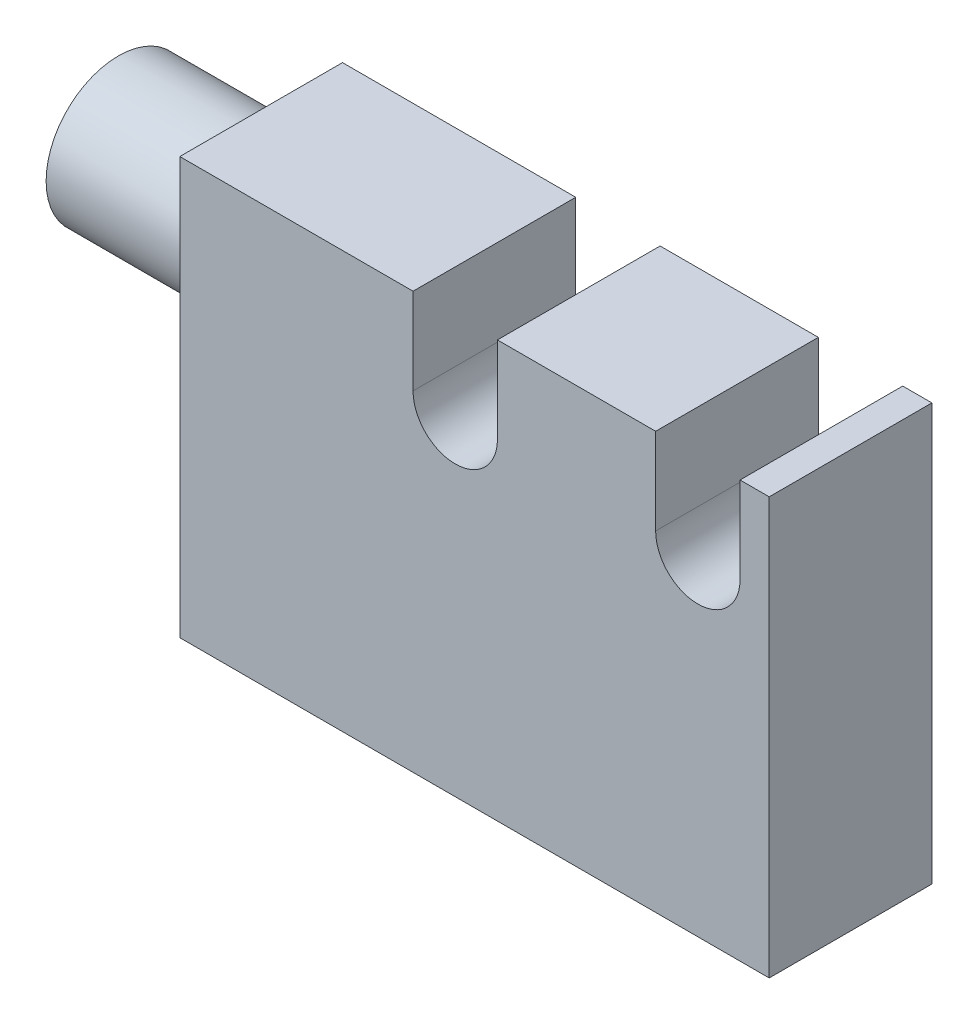
ISO-10303-21;
HEADER;
FILE_DESCRIPTION(('STEP AP214'),'2;1');
FILE_NAME('part.step','',(''),(''),'','','');
FILE_SCHEMA(('AUTOMOTIVE_DESIGN { 1 0 10303 214 1 1 1 1 }'));
ENDSEC;
DATA;
#1=APPLICATION_CONTEXT('core data for automotive mechanical design processes');
#2=APPLICATION_PROTOCOL_DEFINITION('international standard','automotive_design',2000,#1);
#3=PRODUCT_CONTEXT('',#1,'mechanical');
#4=PRODUCT('Part','Part','',(#3));
#5=PRODUCT_RELATED_PRODUCT_CATEGORY('part','',(#4));
#6=PRODUCT_DEFINITION_FORMATION('','',#4);
#7=PRODUCT_DEFINITION_CONTEXT('part definition',#1,'design');
#8=PRODUCT_DEFINITION('design','',#6,#7);
#9=PRODUCT_DEFINITION_SHAPE('','',#8);
#10=(LENGTH_UNIT() NAMED_UNIT(*) SI_UNIT(.MILLI.,.METRE.));
#11=(NAMED_UNIT(*) PLANE_ANGLE_UNIT() SI_UNIT($,.RADIAN.));
#12=(NAMED_UNIT(*) SI_UNIT($,.STERADIAN.) SOLID_ANGLE_UNIT());
#13=UNCERTAINTY_MEASURE_WITH_UNIT(LENGTH_MEASURE(1.E-05),#10,'distance_accuracy_value','');
#14=(GEOMETRIC_REPRESENTATION_CONTEXT(3) GLOBAL_UNCERTAINTY_ASSIGNED_CONTEXT((#13)) GLOBAL_UNIT_ASSIGNED_CONTEXT((#10,
#11,#12)) REPRESENTATION_CONTEXT('',''));
#15=CARTESIAN_POINT('',(0.,0.,0.));
#16=DIRECTION('',(0.,0.,1.));
#17=DIRECTION('',(1.,0.,0.));
#18=AXIS2_PLACEMENT_3D('',#15,#16,#17);
#19=CARTESIAN_POINT('',(0.,13.,11.4));
#20=DIRECTION('',(-1.,0.,0.));
#21=DIRECTION('',(0.,-1.,0.));
#22=AXIS2_PLACEMENT_3D('',#19,#20,#21);
#23=PLANE('',#22);
#24=DIRECTION('',(0.,1.,0.));
#25=VECTOR('',#24,1.);
#26=CARTESIAN_POINT('',(0.,13.,0.));
#27=LINE('',#26,#25);
#28=CARTESIAN_POINT('',(0.,-16.2,0.));
#29=VERTEX_POINT('',#28);
#30=CARTESIAN_POINT('',(0.,13.,0.));
#31=VERTEX_POINT('',#30);
#32=EDGE_CURVE('E149',#29,#31,#27,.T.);
#33=ORIENTED_EDGE('',*,*,#32,.T.);
#34=DIRECTION('',(0.,0.,-1.));
#35=VECTOR('',#34,1.);
#36=CARTESIAN_POINT('',(0.,13.,11.4));
#37=LINE('',#36,#35);
#38=CARTESIAN_POINT('',(0.,13.,11.4));
#39=VERTEX_POINT('',#38);
#40=EDGE_CURVE('E42',#39,#31,#37,.T.);
#41=ORIENTED_EDGE('',*,*,#40,.F.);
#42=DIRECTION('',(0.,1.,0.));
#43=VECTOR('',#42,1.);
#44=CARTESIAN_POINT('',(0.,13.,11.4));
#45=LINE('',#44,#43);
#46=CARTESIAN_POINT('',(0.,-16.2,11.4));
#47=VERTEX_POINT('',#46);
#48=EDGE_CURVE('E171',#47,#39,#45,.T.);
#49=ORIENTED_EDGE('',*,*,#48,.F.);
#50=DIRECTION('',(0.,0.,1.));
#51=VECTOR('',#50,1.);
#52=CARTESIAN_POINT('',(0.,-16.2,0.));
#53=LINE('',#52,#51);
#54=EDGE_CURVE('E197',#29,#47,#53,.T.);
#55=ORIENTED_EDGE('',*,*,#54,.F.);
#56=EDGE_LOOP('',(#33,#41,#49,#55));
#57=FACE_BOUND('',#56,.T.);
#58=ADVANCED_FACE('F34',(#57),#23,.F.);
#59=CARTESIAN_POINT('',(-2.0439672801636,13.,11.4));
#60=DIRECTION('',(0.,-1.,0.));
#61=DIRECTION('',(0.,0.,-1.));
#62=AXIS2_PLACEMENT_3D('',#59,#60,#61);
#63=PLANE('',#62);
#64=DIRECTION('',(-1.,0.,0.));
#65=VECTOR('',#64,1.);
#66=CARTESIAN_POINT('',(-2.0439672801636,13.,0.));
#67=LINE('',#66,#65);
#68=CARTESIAN_POINT('',(-2.0439672801636,13.,0.));
#69=VERTEX_POINT('',#68);
#70=EDGE_CURVE('E152',#31,#69,#67,.T.);
#71=ORIENTED_EDGE('',*,*,#70,.T.);
#72=DIRECTION('',(0.,0.,-1.));
#73=VECTOR('',#72,1.);
#74=CARTESIAN_POINT('',(-2.0439672801636,13.,11.4));
#75=LINE('',#74,#73);
#76=CARTESIAN_POINT('',(-2.0439672801636,13.,11.4));
#77=VERTEX_POINT('',#76);
#78=EDGE_CURVE('E187',#77,#69,#75,.T.);
#79=ORIENTED_EDGE('',*,*,#78,.F.);
#80=DIRECTION('',(-1.,0.,0.));
#81=VECTOR('',#80,1.);
#82=CARTESIAN_POINT('',(-2.0439672801636,13.,11.4));
#83=LINE('',#82,#81);
#84=EDGE_CURVE('E101',#39,#77,#83,.T.);
#85=ORIENTED_EDGE('',*,*,#84,.F.);
#86=ORIENTED_EDGE('',*,*,#40,.T.);
#87=EDGE_LOOP('',(#71,#79,#85,#86));
#88=FACE_BOUND('',#87,.T.);
#89=ADVANCED_FACE('F190',(#88),#63,.F.);
#90=CARTESIAN_POINT('',(-2.0439672801636,6.95,11.4));
#91=DIRECTION('',(1.,0.,0.));
#92=DIRECTION('',(0.,0.,-1.));
#93=AXIS2_PLACEMENT_3D('',#90,#91,#92);
#94=PLANE('',#93);
#95=DIRECTION('',(0.,-1.,0.));
#96=VECTOR('',#95,1.);
#97=CARTESIAN_POINT('',(-2.0439672801636,6.95,0.));
#98=LINE('',#97,#96);
#99=CARTESIAN_POINT('',(-2.0439672801636,6.95,0.));
#100=VERTEX_POINT('',#99);
#101=EDGE_CURVE('E155',#69,#100,#98,.T.);
#102=ORIENTED_EDGE('',*,*,#101,.T.);
#103=DIRECTION('',(0.,0.,-1.));
#104=VECTOR('',#103,1.);
#105=CARTESIAN_POINT('',(-2.0439672801636,6.95,11.4));
#106=LINE('',#105,#104);
#107=CARTESIAN_POINT('',(-2.0439672801636,6.95,11.4));
#108=VERTEX_POINT('',#107);
#109=EDGE_CURVE('E184',#108,#100,#106,.T.);
#110=ORIENTED_EDGE('',*,*,#109,.F.);
#111=DIRECTION('',(0.,-1.,0.));
#112=VECTOR('',#111,1.);
#113=CARTESIAN_POINT('',(-2.0439672801636,6.95,11.4));
#114=LINE('',#113,#112);
#115=EDGE_CURVE('E224',#77,#108,#114,.T.);
#116=ORIENTED_EDGE('',*,*,#115,.F.);
#117=ORIENTED_EDGE('',*,*,#78,.T.);
#118=EDGE_LOOP('',(#102,#110,#116,#117));
#119=FACE_BOUND('',#118,.T.);
#120=ADVANCED_FACE('F248',(#119),#94,.F.);
#121=CARTESIAN_POINT('',(-4.99999999999999,6.95,11.4));
#122=DIRECTION('',(0.,0.,-1.));
#123=DIRECTION('',(-1.,0.,0.));
#124=AXIS2_PLACEMENT_3D('',#121,#122,#123);
#125=CYLINDRICAL_SURFACE('',#124,2.9560327198364);
#126=CARTESIAN_POINT('',(-4.99999999999999,6.95,0.));
#127=DIRECTION('',(0.,0.,-1.));
#128=DIRECTION('',(1.,0.,0.));
#129=AXIS2_PLACEMENT_3D('',#126,#127,#128);
#130=CIRCLE('',#129,2.9560327198364);
#131=CARTESIAN_POINT('',(-7.95603271983639,6.95,0.));
#132=VERTEX_POINT('',#131);
#133=EDGE_CURVE('E157',#100,#132,#130,.T.);
#134=ORIENTED_EDGE('',*,*,#133,.T.);
#135=DIRECTION('',(0.,0.,-1.));
#136=VECTOR('',#135,1.);
#137=CARTESIAN_POINT('',(-7.95603271983639,6.95,11.4));
#138=LINE('',#137,#136);
#139=CARTESIAN_POINT('',(-7.95603271983639,6.95,11.4));
#140=VERTEX_POINT('',#139);
#141=EDGE_CURVE('E181',#140,#132,#138,.T.);
#142=ORIENTED_EDGE('',*,*,#141,.F.);
#143=CARTESIAN_POINT('',(-4.99999999999999,6.95,11.4));
#144=DIRECTION('',(0.,0.,-1.));
#145=DIRECTION('',(1.,0.,0.));
#146=AXIS2_PLACEMENT_3D('',#143,#144,#145);
#147=CIRCLE('',#146,2.9560327198364);
#148=EDGE_CURVE('E226',#108,#140,#147,.T.);
#149=ORIENTED_EDGE('',*,*,#148,.F.);
#150=ORIENTED_EDGE('',*,*,#109,.T.);
#151=EDGE_LOOP('',(#134,#142,#149,#150));
#152=FACE_BOUND('',#151,.T.);
#153=ADVANCED_FACE('F253',(#152),#125,.F.);
#154=CARTESIAN_POINT('',(-7.95603271983639,13.,11.4));
#155=DIRECTION('',(-1.,0.,0.));
#156=DIRECTION('',(0.,-1.,0.));
#157=AXIS2_PLACEMENT_3D('',#154,#155,#156);
#158=PLANE('',#157);
#159=DIRECTION('',(0.,1.,0.));
#160=VECTOR('',#159,1.);
#161=CARTESIAN_POINT('',(-7.95603271983639,13.,0.));
#162=LINE('',#161,#160);
#163=CARTESIAN_POINT('',(-7.95603271983639,13.,0.));
#164=VERTEX_POINT('',#163);
#165=EDGE_CURVE('E159',#132,#164,#162,.T.);
#166=ORIENTED_EDGE('',*,*,#165,.T.);
#167=DIRECTION('',(0.,0.,-1.));
#168=VECTOR('',#167,1.);
#169=CARTESIAN_POINT('',(-7.95603271983639,13.,11.4));
#170=LINE('',#169,#168);
#171=CARTESIAN_POINT('',(-7.95603271983639,13.,11.4));
#172=VERTEX_POINT('',#171);
#173=EDGE_CURVE('E178',#172,#164,#170,.T.);
#174=ORIENTED_EDGE('',*,*,#173,.F.);
#175=DIRECTION('',(0.,1.,0.));
#176=VECTOR('',#175,1.);
#177=CARTESIAN_POINT('',(-7.95603271983639,13.,11.4));
#178=LINE('',#177,#176);
#179=EDGE_CURVE('E228',#140,#172,#178,.T.);
#180=ORIENTED_EDGE('',*,*,#179,.F.);
#181=ORIENTED_EDGE('',*,*,#141,.T.);
#182=EDGE_LOOP('',(#166,#174,#180,#181));
#183=FACE_BOUND('',#182,.T.);
#184=ADVANCED_FACE('F256',(#183),#158,.F.);
#185=CARTESIAN_POINT('',(-19.0439672801636,13.,11.4));
#186=DIRECTION('',(0.,-1.,0.));
#187=DIRECTION('',(1.,0.,0.));
#188=AXIS2_PLACEMENT_3D('',#185,#186,#187);
#189=PLANE('',#188);
#190=DIRECTION('',(-1.,0.,0.));
#191=VECTOR('',#190,1.);
#192=CARTESIAN_POINT('',(-19.0439672801636,13.,0.));
#193=LINE('',#192,#191);
#194=CARTESIAN_POINT('',(-19.0439672801636,13.,0.));
#195=VERTEX_POINT('',#194);
#196=EDGE_CURVE('E161',#164,#195,#193,.T.);
#197=ORIENTED_EDGE('',*,*,#196,.T.);
#198=DIRECTION('',(0.,0.,-1.));
#199=VECTOR('',#198,1.);
#200=CARTESIAN_POINT('',(-19.0439672801636,13.,11.4));
#201=LINE('',#200,#199);
#202=CARTESIAN_POINT('',(-19.0439672801636,13.,11.4));
#203=VERTEX_POINT('',#202);
#204=EDGE_CURVE('E175',#203,#195,#201,.T.);
#205=ORIENTED_EDGE('',*,*,#204,.F.);
#206=DIRECTION('',(-1.,0.,0.));
#207=VECTOR('',#206,1.);
#208=CARTESIAN_POINT('',(-19.0439672801636,13.,11.4));
#209=LINE('',#208,#207);
#210=EDGE_CURVE('E230',#172,#203,#209,.T.);
#211=ORIENTED_EDGE('',*,*,#210,.F.);
#212=ORIENTED_EDGE('',*,*,#173,.T.);
#213=EDGE_LOOP('',(#197,#205,#211,#212));
#214=FACE_BOUND('',#213,.T.);
#215=ADVANCED_FACE('F236',(#214),#189,.F.);
#216=CARTESIAN_POINT('',(-19.0439672801636,6.95,11.4));
#217=DIRECTION('',(1.,0.,0.));
#218=DIRECTION('',(0.,1.,0.));
#219=AXIS2_PLACEMENT_3D('',#216,#217,#218);
#220=PLANE('',#219);
#221=DIRECTION('',(0.,-1.,0.));
#222=VECTOR('',#221,1.);
#223=CARTESIAN_POINT('',(-19.0439672801636,6.95,0.));
#224=LINE('',#223,#222);
#225=CARTESIAN_POINT('',(-19.0439672801636,6.95,0.));
#226=VERTEX_POINT('',#225);
#227=EDGE_CURVE('E163',#195,#226,#224,.T.);
#228=ORIENTED_EDGE('',*,*,#227,.T.);
#229=DIRECTION('',(0.,0.,-1.));
#230=VECTOR('',#229,1.);
#231=CARTESIAN_POINT('',(-19.0439672801636,6.95,11.4));
#232=LINE('',#231,#230);
#233=CARTESIAN_POINT('',(-19.0439672801636,6.95,11.4));
#234=VERTEX_POINT('',#233);
#235=EDGE_CURVE('E138',#234,#226,#232,.T.);
#236=ORIENTED_EDGE('',*,*,#235,.F.);
#237=DIRECTION('',(0.,-1.,0.));
#238=VECTOR('',#237,1.);
#239=CARTESIAN_POINT('',(-19.0439672801636,6.95,11.4));
#240=LINE('',#239,#238);
#241=EDGE_CURVE('E129',#203,#234,#240,.T.);
#242=ORIENTED_EDGE('',*,*,#241,.F.);
#243=ORIENTED_EDGE('',*,*,#204,.T.);
#244=EDGE_LOOP('',(#228,#236,#242,#243));
#245=FACE_BOUND('',#244,.T.);
#246=ADVANCED_FACE('F240',(#245),#220,.F.);
#247=CARTESIAN_POINT('',(-22.,6.95,11.4));
#248=DIRECTION('',(0.,0.,-1.));
#249=DIRECTION('',(-1.,0.,0.));
#250=AXIS2_PLACEMENT_3D('',#247,#248,#249);
#251=CYLINDRICAL_SURFACE('',#250,2.9560327198364);
#252=CARTESIAN_POINT('',(-22.,6.95,0.));
#253=DIRECTION('',(0.,0.,-1.));
#254=DIRECTION('',(1.,0.,0.));
#255=AXIS2_PLACEMENT_3D('',#252,#253,#254);
#256=CIRCLE('',#255,2.9560327198364);
#257=CARTESIAN_POINT('',(-24.9560327198364,6.95,0.));
#258=VERTEX_POINT('',#257);
#259=EDGE_CURVE('E137',#226,#258,#256,.T.);
#260=ORIENTED_EDGE('',*,*,#259,.T.);
#261=DIRECTION('',(0.,0.,-1.));
#262=VECTOR('',#261,1.);
#263=CARTESIAN_POINT('',(-24.9560327198364,6.95,11.4));
#264=LINE('',#263,#262);
#265=CARTESIAN_POINT('',(-24.9560327198364,6.95,11.4));
#266=VERTEX_POINT('',#265);
#267=EDGE_CURVE('E134',#266,#258,#264,.T.);
#268=ORIENTED_EDGE('',*,*,#267,.F.);
#269=CARTESIAN_POINT('',(-22.,6.95,11.4));
#270=DIRECTION('',(0.,0.,-1.));
#271=DIRECTION('',(1.,0.,0.));
#272=AXIS2_PLACEMENT_3D('',#269,#270,#271);
#273=CIRCLE('',#272,2.9560327198364);
#274=EDGE_CURVE('E123',#234,#266,#273,.T.);
#275=ORIENTED_EDGE('',*,*,#274,.F.);
#276=ORIENTED_EDGE('',*,*,#235,.T.);
#277=EDGE_LOOP('',(#260,#268,#275,#276));
#278=FACE_BOUND('',#277,.T.);
#279=ADVANCED_FACE('F135',(#278),#251,.F.);
#280=CARTESIAN_POINT('',(-24.9560327198364,13.,11.4));
#281=DIRECTION('',(-1.,0.,0.));
#282=DIRECTION('',(0.,0.,1.));
#283=AXIS2_PLACEMENT_3D('',#280,#281,#282);
#284=PLANE('',#283);
#285=DIRECTION('',(0.,1.,0.));
#286=VECTOR('',#285,1.);
#287=CARTESIAN_POINT('',(-24.9560327198364,13.,0.));
#288=LINE('',#287,#286);
#289=CARTESIAN_POINT('',(-24.9560327198364,13.,0.));
#290=VERTEX_POINT('',#289);
#291=EDGE_CURVE('E86',#258,#290,#288,.T.);
#292=ORIENTED_EDGE('',*,*,#291,.T.);
#293=DIRECTION('',(0.,0.,-1.));
#294=VECTOR('',#293,1.);
#295=CARTESIAN_POINT('',(-24.9560327198364,13.,11.4));
#296=LINE('',#295,#294);
#297=CARTESIAN_POINT('',(-24.9560327198364,13.,11.4));
#298=VERTEX_POINT('',#297);
#299=EDGE_CURVE('E139',#298,#290,#296,.T.);
#300=ORIENTED_EDGE('',*,*,#299,.F.);
#301=DIRECTION('',(0.,1.,0.));
#302=VECTOR('',#301,1.);
#303=CARTESIAN_POINT('',(-24.9560327198364,13.,11.4));
#304=LINE('',#303,#302);
#305=EDGE_CURVE('E127',#266,#298,#304,.T.);
#306=ORIENTED_EDGE('',*,*,#305,.F.);
#307=ORIENTED_EDGE('',*,*,#267,.T.);
#308=EDGE_LOOP('',(#292,#300,#306,#307));
#309=FACE_BOUND('',#308,.T.);
#310=ADVANCED_FACE('F141',(#309),#284,.F.);
#311=CARTESIAN_POINT('',(-41.3,13.,11.4));
#312=DIRECTION('',(0.,-1.,0.));
#313=DIRECTION('',(0.,0.,-1.));
#314=AXIS2_PLACEMENT_3D('',#311,#312,#313);
#315=PLANE('',#314);
#316=DIRECTION('',(-1.,0.,0.));
#317=VECTOR('',#316,1.);
#318=CARTESIAN_POINT('',(-41.3,13.,0.));
#319=LINE('',#318,#317);
#320=CARTESIAN_POINT('',(-41.3,13.,0.));
#321=VERTEX_POINT('',#320);
#322=EDGE_CURVE('E92',#290,#321,#319,.T.);
#323=ORIENTED_EDGE('',*,*,#322,.T.);
#324=DIRECTION('',(0.,0.,-1.));
#325=VECTOR('',#324,1.);
#326=CARTESIAN_POINT('',(-41.3,13.,11.4));
#327=LINE('',#326,#325);
#328=CARTESIAN_POINT('',(-41.3,13.,11.4));
#329=VERTEX_POINT('',#328);
#330=EDGE_CURVE('E148',#329,#321,#327,.T.);
#331=ORIENTED_EDGE('',*,*,#330,.F.);
#332=DIRECTION('',(-1.,0.,0.));
#333=VECTOR('',#332,1.);
#334=CARTESIAN_POINT('',(-41.3,13.,11.4));
#335=LINE('',#334,#333);
#336=EDGE_CURVE('E50',#298,#329,#335,.T.);
#337=ORIENTED_EDGE('',*,*,#336,.F.);
#338=ORIENTED_EDGE('',*,*,#299,.T.);
#339=EDGE_LOOP('',(#323,#331,#337,#338));
#340=FACE_BOUND('',#339,.T.);
#341=ADVANCED_FACE('F314',(#340),#315,.F.);
#342=CARTESIAN_POINT('',(-41.3,0.,11.4));
#343=DIRECTION('',(1.,0.,0.));
#344=DIRECTION('',(0.,1.,0.));
#345=AXIS2_PLACEMENT_3D('',#342,#343,#344);
#346=PLANE('',#345);
#347=CARTESIAN_POINT('',(-41.3,6.19209664398482,5.7));
#348=DIRECTION('',(1.,0.,0.));
#349=DIRECTION('',(0.,1.,0.));
#350=AXIS2_PLACEMENT_3D('',#347,#348,#349);
#351=CIRCLE('',#350,5.06821181472758);
#352=CARTESIAN_POINT('',(-41.3,11.2603084587124,5.7));
#353=VERTEX_POINT('',#352);
#354=EDGE_CURVE('E11',#353,#353,#351,.F.);
#355=ORIENTED_EDGE('',*,*,#354,.F.);
#356=EDGE_LOOP('',(#355));
#357=FACE_BOUND('',#356,.T.);
#358=DIRECTION('',(0.,-1.,0.));
#359=VECTOR('',#358,1.);
#360=CARTESIAN_POINT('',(-41.3,0.,0.));
#361=LINE('',#360,#359);
#362=CARTESIAN_POINT('',(-41.3,-16.2,0.));
#363=VERTEX_POINT('',#362);
#364=EDGE_CURVE('E168',#321,#363,#361,.T.);
#365=ORIENTED_EDGE('',*,*,#364,.T.);
#366=DIRECTION('',(0.,0.,-1.));
#367=VECTOR('',#366,1.);
#368=CARTESIAN_POINT('',(-41.3,-16.2,11.4));
#369=LINE('',#368,#367);
#370=CARTESIAN_POINT('',(-41.3,-16.2,11.4));
#371=VERTEX_POINT('',#370);
#372=EDGE_CURVE('E214',#371,#363,#369,.T.);
#373=ORIENTED_EDGE('',*,*,#372,.F.);
#374=DIRECTION('',(0.,-1.,0.));
#375=VECTOR('',#374,1.);
#376=CARTESIAN_POINT('',(-41.3,0.,11.4));
#377=LINE('',#376,#375);
#378=EDGE_CURVE('E143',#329,#371,#377,.T.);
#379=ORIENTED_EDGE('',*,*,#378,.F.);
#380=ORIENTED_EDGE('',*,*,#330,.T.);
#381=EDGE_LOOP('',(#365,#373,#379,#380));
#382=FACE_BOUND('',#381,.T.);
#383=ADVANCED_FACE('F242',(#357,#382),#346,.F.);
#384=CARTESIAN_POINT('',(-22.,6.95,11.4));
#385=DIRECTION('',(0.,0.,1.));
#386=DIRECTION('',(1.,0.,0.));
#387=AXIS2_PLACEMENT_3D('',#384,#385,#386);
#388=PLANE('',#387);
#389=ORIENTED_EDGE('',*,*,#48,.T.);
#390=ORIENTED_EDGE('',*,*,#84,.T.);
#391=ORIENTED_EDGE('',*,*,#115,.T.);
#392=ORIENTED_EDGE('',*,*,#148,.T.);
#393=ORIENTED_EDGE('',*,*,#179,.T.);
#394=ORIENTED_EDGE('',*,*,#210,.T.);
#395=ORIENTED_EDGE('',*,*,#241,.T.);
#396=ORIENTED_EDGE('',*,*,#274,.T.);
#397=ORIENTED_EDGE('',*,*,#305,.T.);
#398=ORIENTED_EDGE('',*,*,#336,.T.);
#399=ORIENTED_EDGE('',*,*,#378,.T.);
#400=DIRECTION('',(-1.,0.,0.));
#401=VECTOR('',#400,1.);
#402=CARTESIAN_POINT('',(0.,-16.2,11.4));
#403=LINE('',#402,#401);
#404=EDGE_CURVE('E153',#47,#371,#403,.T.);
#405=ORIENTED_EDGE('',*,*,#404,.F.);
#406=EDGE_LOOP('',(#389,#390,#391,#392,#393,#394,#395,#396,#397,#398,#399,#405));
#407=FACE_BOUND('',#406,.T.);
#408=ADVANCED_FACE('F125',(#407),#388,.T.);
#409=CARTESIAN_POINT('',(-22.,6.95,0.));
#410=DIRECTION('',(0.,0.,1.));
#411=DIRECTION('',(1.,0.,0.));
#412=AXIS2_PLACEMENT_3D('',#409,#410,#411);
#413=PLANE('',#412);
#414=ORIENTED_EDGE('',*,*,#32,.F.);
#415=DIRECTION('',(1.,0.,0.));
#416=VECTOR('',#415,1.);
#417=CARTESIAN_POINT('',(-41.3,-16.2,0.));
#418=LINE('',#417,#416);
#419=EDGE_CURVE('E204',#363,#29,#418,.T.);
#420=ORIENTED_EDGE('',*,*,#419,.F.);
#421=ORIENTED_EDGE('',*,*,#364,.F.);
#422=ORIENTED_EDGE('',*,*,#322,.F.);
#423=ORIENTED_EDGE('',*,*,#291,.F.);
#424=ORIENTED_EDGE('',*,*,#259,.F.);
#425=ORIENTED_EDGE('',*,*,#227,.F.);
#426=ORIENTED_EDGE('',*,*,#196,.F.);
#427=ORIENTED_EDGE('',*,*,#165,.F.);
#428=ORIENTED_EDGE('',*,*,#133,.F.);
#429=ORIENTED_EDGE('',*,*,#101,.F.);
#430=ORIENTED_EDGE('',*,*,#70,.F.);
#431=EDGE_LOOP('',(#414,#420,#421,#422,#423,#424,#425,#426,#427,#428,#429,#430));
#432=FACE_BOUND('',#431,.T.);
#433=ADVANCED_FACE('F201',(#432),#413,.F.);
#434=CARTESIAN_POINT('',(0.,-16.2,0.));
#435=DIRECTION('',(0.,-1.,0.));
#436=DIRECTION('',(0.,0.,-1.));
#437=AXIS2_PLACEMENT_3D('',#434,#435,#436);
#438=PLANE('',#437);
#439=ORIENTED_EDGE('',*,*,#372,.T.);
#440=ORIENTED_EDGE('',*,*,#419,.T.);
#441=ORIENTED_EDGE('',*,*,#54,.T.);
#442=ORIENTED_EDGE('',*,*,#404,.T.);
#443=EDGE_LOOP('',(#439,#440,#441,#442));
#444=FACE_BOUND('',#443,.T.);
#445=ADVANCED_FACE('F210',(#444),#438,.T.);
#446=CARTESIAN_POINT('',(-51.3,6.19209664398483,5.7));
#447=DIRECTION('',(1.,0.,0.));
#448=DIRECTION('',(0.,1.,0.));
#449=AXIS2_PLACEMENT_3D('',#446,#447,#448);
#450=CYLINDRICAL_SURFACE('',#449,5.06821181472758);
#451=CARTESIAN_POINT('',(-51.3,6.19209664398483,5.7));
#452=DIRECTION('',(-1.,0.,0.));
#453=DIRECTION('',(0.,-1.,0.));
#454=AXIS2_PLACEMENT_3D('',#451,#452,#453);
#455=CIRCLE('',#454,5.06821181472758);
#456=CARTESIAN_POINT('',(-51.3,1.12388482925725,5.7));
#457=VERTEX_POINT('',#456);
#458=EDGE_CURVE('E217',#457,#457,#455,.T.);
#459=ORIENTED_EDGE('',*,*,#458,.F.);
#460=EDGE_LOOP('',(#459));
#461=FACE_BOUND('',#460,.T.);
#462=ORIENTED_EDGE('',*,*,#354,.T.);
#463=EDGE_LOOP('',(#462));
#464=FACE_BOUND('',#463,.T.);
#465=ADVANCED_FACE('F357',(#461,#464),#450,.T.);
#466=CARTESIAN_POINT('',(-51.3,6.19209664398483,5.7));
#467=DIRECTION('',(-1.,0.,0.));
#468=DIRECTION('',(0.,-1.,0.));
#469=AXIS2_PLACEMENT_3D('',#466,#467,#468);
#470=PLANE('',#469);
#471=ORIENTED_EDGE('',*,*,#458,.T.);
#472=EDGE_LOOP('',(#471));
#473=FACE_BOUND('',#472,.T.);
#474=ADVANCED_FACE('F373',(#473),#470,.T.);
#475=CLOSED_SHELL('',(#58,#89,#120,#153,#184,#215,#246,#279,#310,#341,#383,#408,#433,#445,#465,#474));
#476=MANIFOLD_SOLID_BREP('B2',#475);
#477=ADVANCED_BREP_SHAPE_REPRESENTATION('',(#18,#476),#14);
#478=SHAPE_DEFINITION_REPRESENTATION(#9,#477);
ENDSEC;
END-ISO-10303-21;
